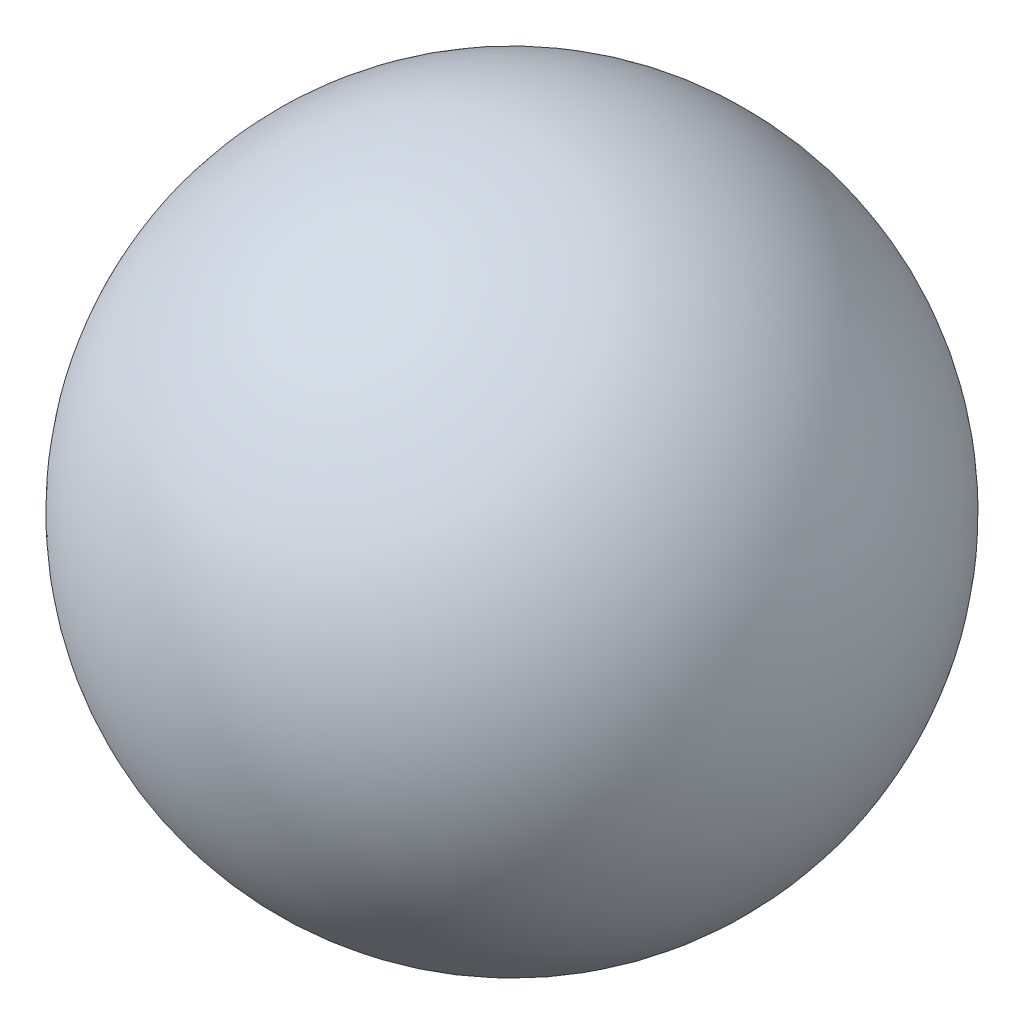
ISO-10303-21;
HEADER;
FILE_DESCRIPTION(('STEP AP214'),'2;1');
FILE_NAME('part.step','',(''),(''),'','','');
FILE_SCHEMA(('AUTOMOTIVE_DESIGN { 1 0 10303 214 1 1 1 1 }'));
ENDSEC;
DATA;
#1=APPLICATION_CONTEXT('core data for automotive mechanical design processes');
#2=APPLICATION_PROTOCOL_DEFINITION('international standard','automotive_design',2000,#1);
#3=PRODUCT_CONTEXT('',#1,'mechanical');
#4=PRODUCT('Part','Part','',(#3));
#5=PRODUCT_RELATED_PRODUCT_CATEGORY('part','',(#4));
#6=PRODUCT_DEFINITION_FORMATION('','',#4);
#7=PRODUCT_DEFINITION_CONTEXT('part definition',#1,'design');
#8=PRODUCT_DEFINITION('design','',#6,#7);
#9=PRODUCT_DEFINITION_SHAPE('','',#8);
#10=(LENGTH_UNIT() NAMED_UNIT(*) SI_UNIT(.MILLI.,.METRE.));
#11=(NAMED_UNIT(*) PLANE_ANGLE_UNIT() SI_UNIT($,.RADIAN.));
#12=(NAMED_UNIT(*) SI_UNIT($,.STERADIAN.) SOLID_ANGLE_UNIT());
#13=UNCERTAINTY_MEASURE_WITH_UNIT(LENGTH_MEASURE(1.E-05),#10,'distance_accuracy_value','');
#14=(GEOMETRIC_REPRESENTATION_CONTEXT(3) GLOBAL_UNCERTAINTY_ASSIGNED_CONTEXT((#13)) GLOBAL_UNIT_ASSIGNED_CONTEXT((#10,
#11,#12)) REPRESENTATION_CONTEXT('',''));
#15=CARTESIAN_POINT('',(0.,0.,0.));
#16=DIRECTION('',(0.,0.,1.));
#17=DIRECTION('',(1.,0.,0.));
#18=AXIS2_PLACEMENT_3D('',#15,#16,#17);
#19=CARTESIAN_POINT('',(0.,0.,0.));
#20=DIRECTION('',(-1.,0.,0.));
#21=DIRECTION('',(0.,1.,0.));
#22=AXIS2_PLACEMENT_3D('',#19,#20,#21);
#23=SPHERICAL_SURFACE('',#22,2.25);
#24=CARTESIAN_POINT('',(-2.25,0.,0.));
#25=VERTEX_POINT('',#24);
#26=VERTEX_LOOP('',#25);
#27=FACE_BOUND('',#26,.T.);
#28=ADVANCED_FACE('F27',(#27),#23,.T.);
#29=CLOSED_SHELL('',(#28));
#30=MANIFOLD_SOLID_BREP('B2',#29);
#31=ADVANCED_BREP_SHAPE_REPRESENTATION('',(#18,#30),#14);
#32=SHAPE_DEFINITION_REPRESENTATION(#9,#31);
ENDSEC;
END-ISO-10303-21;
